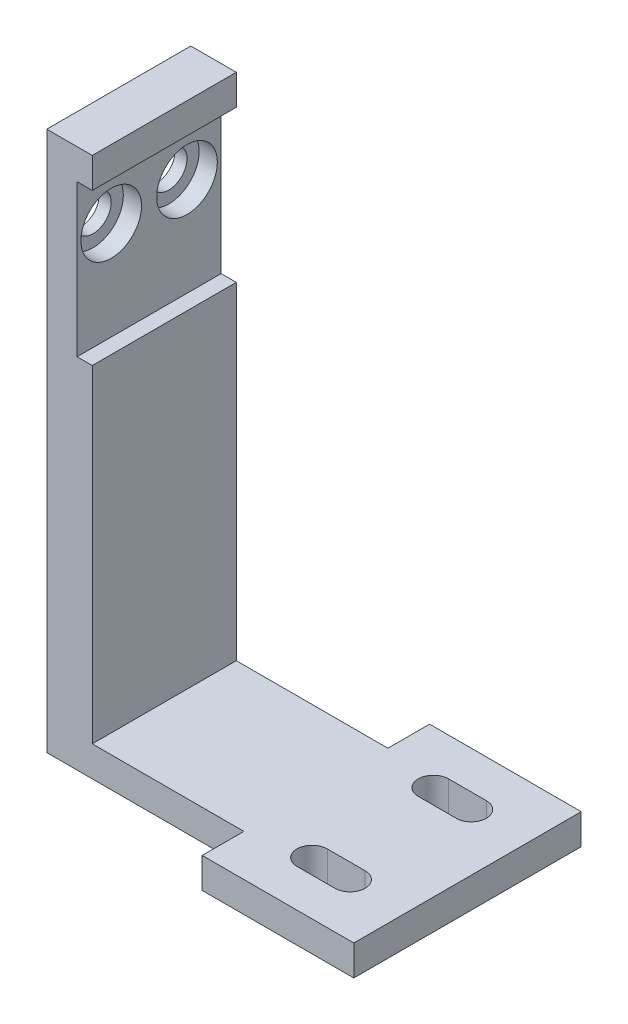
ISO-10303-21;
HEADER;
FILE_DESCRIPTION(('STEP AP214'),'2;1');
FILE_NAME('part.step','',(''),(''),'','','');
FILE_SCHEMA(('AUTOMOTIVE_DESIGN { 1 0 10303 214 1 1 1 1 }'));
ENDSEC;
DATA;
#1=APPLICATION_CONTEXT('core data for automotive mechanical design processes');
#2=APPLICATION_PROTOCOL_DEFINITION('international standard','automotive_design',2000,#1);
#3=PRODUCT_CONTEXT('',#1,'mechanical');
#4=PRODUCT('Part','Part','',(#3));
#5=PRODUCT_RELATED_PRODUCT_CATEGORY('part','',(#4));
#6=PRODUCT_DEFINITION_FORMATION('','',#4);
#7=PRODUCT_DEFINITION_CONTEXT('part definition',#1,'design');
#8=PRODUCT_DEFINITION('design','',#6,#7);
#9=PRODUCT_DEFINITION_SHAPE('','',#8);
#10=(LENGTH_UNIT() NAMED_UNIT(*) SI_UNIT(.MILLI.,.METRE.));
#11=(NAMED_UNIT(*) PLANE_ANGLE_UNIT() SI_UNIT($,.RADIAN.));
#12=(NAMED_UNIT(*) SI_UNIT($,.STERADIAN.) SOLID_ANGLE_UNIT());
#13=UNCERTAINTY_MEASURE_WITH_UNIT(LENGTH_MEASURE(1.E-05),#10,'distance_accuracy_value','');
#14=(GEOMETRIC_REPRESENTATION_CONTEXT(3) GLOBAL_UNCERTAINTY_ASSIGNED_CONTEXT((#13)) GLOBAL_UNIT_ASSIGNED_CONTEXT((#10,
#11,#12)) REPRESENTATION_CONTEXT('',''));
#15=CARTESIAN_POINT('',(0.,0.,0.));
#16=DIRECTION('',(0.,0.,1.));
#17=DIRECTION('',(1.,0.,0.));
#18=AXIS2_PLACEMENT_3D('',#15,#16,#17);
#19=CARTESIAN_POINT('',(-17.5373741798521,22.,-2.5));
#20=DIRECTION('',(1.,0.,0.));
#21=DIRECTION('',(0.,0.,-1.));
#22=AXIS2_PLACEMENT_3D('',#19,#20,#21);
#23=CYLINDRICAL_SURFACE('',#22,1.2);
#24=CARTESIAN_POINT('',(-19.5373741798521,22.,-2.5));
#25=DIRECTION('',(1.,0.,0.));
#26=DIRECTION('',(0.,0.,-1.));
#27=AXIS2_PLACEMENT_3D('',#24,#25,#26);
#28=CIRCLE('',#27,1.2);
#29=CARTESIAN_POINT('',(-19.5373741798521,22.,-3.7));
#30=VERTEX_POINT('',#29);
#31=EDGE_CURVE('E337',#30,#30,#28,.T.);
#32=ORIENTED_EDGE('',*,*,#31,.F.);
#33=EDGE_LOOP('',(#32));
#34=FACE_BOUND('',#33,.T.);
#35=CARTESIAN_POINT('',(-18.7373741798521,22.,-2.5));
#36=DIRECTION('',(1.,0.,0.));
#37=DIRECTION('',(0.,0.,-1.));
#38=AXIS2_PLACEMENT_3D('',#35,#36,#37);
#39=CIRCLE('',#38,1.2);
#40=CARTESIAN_POINT('',(-18.7373741798521,22.,-3.7));
#41=VERTEX_POINT('',#40);
#42=EDGE_CURVE('E338',#41,#41,#39,.F.);
#43=ORIENTED_EDGE('',*,*,#42,.F.);
#44=EDGE_LOOP('',(#43));
#45=FACE_BOUND('',#44,.T.);
#46=ADVANCED_FACE('F41',(#34,#45),#23,.F.);
#47=CARTESIAN_POINT('',(-17.5373741798521,22.,2.5));
#48=DIRECTION('',(1.,0.,0.));
#49=DIRECTION('',(0.,0.,-1.));
#50=AXIS2_PLACEMENT_3D('',#47,#48,#49);
#51=CYLINDRICAL_SURFACE('',#50,1.2);
#52=CARTESIAN_POINT('',(-19.5373741798521,22.,2.5));
#53=DIRECTION('',(1.,0.,0.));
#54=DIRECTION('',(0.,0.,-1.));
#55=AXIS2_PLACEMENT_3D('',#52,#53,#54);
#56=CIRCLE('',#55,1.2);
#57=CARTESIAN_POINT('',(-19.5373741798521,22.,1.3));
#58=VERTEX_POINT('',#57);
#59=EDGE_CURVE('E333',#58,#58,#56,.T.);
#60=ORIENTED_EDGE('',*,*,#59,.F.);
#61=EDGE_LOOP('',(#60));
#62=FACE_BOUND('',#61,.T.);
#63=CARTESIAN_POINT('',(-18.7373741798521,22.,2.5));
#64=DIRECTION('',(1.,0.,0.));
#65=DIRECTION('',(0.,0.,-1.));
#66=AXIS2_PLACEMENT_3D('',#63,#64,#65);
#67=CIRCLE('',#66,1.2);
#68=CARTESIAN_POINT('',(-18.7373741798521,22.,1.3));
#69=VERTEX_POINT('',#68);
#70=EDGE_CURVE('E321',#69,#69,#67,.F.);
#71=ORIENTED_EDGE('',*,*,#70,.F.);
#72=EDGE_LOOP('',(#71));
#73=FACE_BOUND('',#72,.T.);
#74=ADVANCED_FACE('F445',(#62,#73),#51,.F.);
#75=CARTESIAN_POINT('',(-16.537374179852,15.5,4.75));
#76=DIRECTION('',(-1.,0.,0.));
#77=DIRECTION('',(0.,0.,1.));
#78=AXIS2_PLACEMENT_3D('',#75,#76,#77);
#79=PLANE('',#78);
#80=DIRECTION('',(0.,1.,0.));
#81=VECTOR('',#80,1.);
#82=CARTESIAN_POINT('',(-16.537374179852,15.5,-4.75));
#83=LINE('',#82,#81);
#84=CARTESIAN_POINT('',(-16.537374179852,-6.11,-4.75));
#85=VERTEX_POINT('',#84);
#86=CARTESIAN_POINT('',(-16.537374179852,15.5,-4.75));
#87=VERTEX_POINT('',#86);
#88=EDGE_CURVE('E342',#85,#87,#83,.T.);
#89=ORIENTED_EDGE('',*,*,#88,.T.);
#90=DIRECTION('',(0.,0.,-1.));
#91=VECTOR('',#90,1.);
#92=CARTESIAN_POINT('',(-16.537374179852,15.5,4.75));
#93=LINE('',#92,#91);
#94=CARTESIAN_POINT('',(-16.537374179852,15.5,4.75));
#95=VERTEX_POINT('',#94);
#96=EDGE_CURVE('E50',#95,#87,#93,.T.);
#97=ORIENTED_EDGE('',*,*,#96,.F.);
#98=DIRECTION('',(0.,1.,0.));
#99=VECTOR('',#98,1.);
#100=CARTESIAN_POINT('',(-16.537374179852,12.5,4.75));
#101=LINE('',#100,#99);
#102=CARTESIAN_POINT('',(-16.537374179852,-6.11,4.75));
#103=VERTEX_POINT('',#102);
#104=EDGE_CURVE('E343',#103,#95,#101,.T.);
#105=ORIENTED_EDGE('',*,*,#104,.F.);
#106=DIRECTION('',(0.,0.,-1.));
#107=VECTOR('',#106,1.);
#108=CARTESIAN_POINT('',(-16.537374179852,-6.11,4.75));
#109=LINE('',#108,#107);
#110=EDGE_CURVE('E371',#103,#85,#109,.T.);
#111=ORIENTED_EDGE('',*,*,#110,.T.);
#112=EDGE_LOOP('',(#89,#97,#105,#111));
#113=FACE_BOUND('',#112,.T.);
#114=ADVANCED_FACE('F43',(#113),#79,.F.);
#115=CARTESIAN_POINT('',(-17.537374179852,15.5,4.75));
#116=DIRECTION('',(0.,-1.,0.));
#117=DIRECTION('',(0.,0.,-1.));
#118=AXIS2_PLACEMENT_3D('',#115,#116,#117);
#119=PLANE('',#118);
#120=DIRECTION('',(-1.,0.,0.));
#121=VECTOR('',#120,1.);
#122=CARTESIAN_POINT('',(-17.537374179852,15.5,-4.75));
#123=LINE('',#122,#121);
#124=CARTESIAN_POINT('',(-17.537374179852,15.5,-4.75));
#125=VERTEX_POINT('',#124);
#126=EDGE_CURVE('E374',#87,#125,#123,.T.);
#127=ORIENTED_EDGE('',*,*,#126,.T.);
#128=DIRECTION('',(0.,0.,-1.));
#129=VECTOR('',#128,1.);
#130=CARTESIAN_POINT('',(-17.537374179852,15.5,4.75));
#131=LINE('',#130,#129);
#132=CARTESIAN_POINT('',(-17.537374179852,15.5,4.75));
#133=VERTEX_POINT('',#132);
#134=EDGE_CURVE('E429',#133,#125,#131,.T.);
#135=ORIENTED_EDGE('',*,*,#134,.F.);
#136=DIRECTION('',(-1.,0.,0.));
#137=VECTOR('',#136,1.);
#138=CARTESIAN_POINT('',(-17.537374179852,15.5,4.75));
#139=LINE('',#138,#137);
#140=EDGE_CURVE('E346',#95,#133,#139,.T.);
#141=ORIENTED_EDGE('',*,*,#140,.F.);
#142=ORIENTED_EDGE('',*,*,#96,.T.);
#143=EDGE_LOOP('',(#127,#135,#141,#142));
#144=FACE_BOUND('',#143,.T.);
#145=ADVANCED_FACE('F493',(#144),#119,.F.);
#146=CARTESIAN_POINT('',(-17.537374179852,15.5,4.75));
#147=DIRECTION('',(-1.,0.,0.));
#148=DIRECTION('',(0.,-1.,0.));
#149=AXIS2_PLACEMENT_3D('',#146,#147,#148);
#150=PLANE('',#149);
#151=CARTESIAN_POINT('',(-17.5373741798521,22.,2.5));
#152=DIRECTION('',(1.,0.,0.));
#153=DIRECTION('',(0.,0.,-1.));
#154=AXIS2_PLACEMENT_3D('',#151,#152,#153);
#155=CIRCLE('',#154,2.);
#156=CARTESIAN_POINT('',(-17.5373741798521,22.,0.499999999999998));
#157=VERTEX_POINT('',#156);
#158=EDGE_CURVE('E322',#157,#157,#155,.T.);
#159=ORIENTED_EDGE('',*,*,#158,.F.);
#160=EDGE_LOOP('',(#159));
#161=FACE_BOUND('',#160,.T.);
#162=CARTESIAN_POINT('',(-17.5373741798521,22.,-2.5));
#163=DIRECTION('',(1.,0.,0.));
#164=DIRECTION('',(0.,0.,-1.));
#165=AXIS2_PLACEMENT_3D('',#162,#163,#164);
#166=CIRCLE('',#165,2.);
#167=CARTESIAN_POINT('',(-17.5373741798521,22.,-4.5));
#168=VERTEX_POINT('',#167);
#169=EDGE_CURVE('E316',#168,#168,#166,.T.);
#170=ORIENTED_EDGE('',*,*,#169,.F.);
#171=EDGE_LOOP('',(#170));
#172=FACE_BOUND('',#171,.T.);
#173=DIRECTION('',(0.,1.,0.));
#174=VECTOR('',#173,1.);
#175=CARTESIAN_POINT('',(-17.537374179852,15.5,-4.75));
#176=LINE('',#175,#174);
#177=CARTESIAN_POINT('',(-17.537374179852,25.5,-4.75));
#178=VERTEX_POINT('',#177);
#179=EDGE_CURVE('E377',#125,#178,#176,.T.);
#180=ORIENTED_EDGE('',*,*,#179,.T.);
#181=DIRECTION('',(0.,0.,-1.));
#182=VECTOR('',#181,1.);
#183=CARTESIAN_POINT('',(-17.537374179852,25.5,4.75));
#184=LINE('',#183,#182);
#185=CARTESIAN_POINT('',(-17.537374179852,25.5,4.75));
#186=VERTEX_POINT('',#185);
#187=EDGE_CURVE('E425',#186,#178,#184,.T.);
#188=ORIENTED_EDGE('',*,*,#187,.F.);
#189=DIRECTION('',(0.,1.,0.));
#190=VECTOR('',#189,1.);
#191=CARTESIAN_POINT('',(-17.537374179852,15.5,4.75));
#192=LINE('',#191,#190);
#193=EDGE_CURVE('E350',#133,#186,#192,.T.);
#194=ORIENTED_EDGE('',*,*,#193,.F.);
#195=ORIENTED_EDGE('',*,*,#134,.T.);
#196=EDGE_LOOP('',(#180,#188,#194,#195));
#197=FACE_BOUND('',#196,.T.);
#198=ADVANCED_FACE('F490',(#161,#172,#197),#150,.F.);
#199=CARTESIAN_POINT('',(-17.537374179852,25.5,4.75));
#200=DIRECTION('',(0.,1.,0.));
#201=DIRECTION('',(0.,0.,1.));
#202=AXIS2_PLACEMENT_3D('',#199,#200,#201);
#203=PLANE('',#202);
#204=DIRECTION('',(1.,0.,0.));
#205=VECTOR('',#204,1.);
#206=CARTESIAN_POINT('',(-17.537374179852,25.5,-4.75));
#207=LINE('',#206,#205);
#208=CARTESIAN_POINT('',(-16.537374179852,25.5,-4.75));
#209=VERTEX_POINT('',#208);
#210=EDGE_CURVE('E380',#178,#209,#207,.T.);
#211=ORIENTED_EDGE('',*,*,#210,.T.);
#212=DIRECTION('',(0.,0.,-1.));
#213=VECTOR('',#212,1.);
#214=CARTESIAN_POINT('',(-16.537374179852,25.5,4.75));
#215=LINE('',#214,#213);
#216=CARTESIAN_POINT('',(-16.537374179852,25.5,4.75));
#217=VERTEX_POINT('',#216);
#218=EDGE_CURVE('E421',#217,#209,#215,.T.);
#219=ORIENTED_EDGE('',*,*,#218,.F.);
#220=DIRECTION('',(1.,0.,0.));
#221=VECTOR('',#220,1.);
#222=CARTESIAN_POINT('',(-17.537374179852,25.5,4.75));
#223=LINE('',#222,#221);
#224=EDGE_CURVE('E353',#186,#217,#223,.T.);
#225=ORIENTED_EDGE('',*,*,#224,.F.);
#226=ORIENTED_EDGE('',*,*,#187,.T.);
#227=EDGE_LOOP('',(#211,#219,#225,#226));
#228=FACE_BOUND('',#227,.T.);
#229=ADVANCED_FACE('F486',(#228),#203,.F.);
#230=CARTESIAN_POINT('',(-16.537374179852,27.5,4.75));
#231=DIRECTION('',(-1.,0.,0.));
#232=DIRECTION('',(0.,-1.,0.));
#233=AXIS2_PLACEMENT_3D('',#230,#231,#232);
#234=PLANE('',#233);
#235=DIRECTION('',(0.,1.,0.));
#236=VECTOR('',#235,1.);
#237=CARTESIAN_POINT('',(-16.537374179852,27.5,-4.75));
#238=LINE('',#237,#236);
#239=CARTESIAN_POINT('',(-16.537374179852,27.5,-4.75));
#240=VERTEX_POINT('',#239);
#241=EDGE_CURVE('E383',#209,#240,#238,.T.);
#242=ORIENTED_EDGE('',*,*,#241,.T.);
#243=DIRECTION('',(0.,0.,-1.));
#244=VECTOR('',#243,1.);
#245=CARTESIAN_POINT('',(-16.537374179852,27.5,4.75));
#246=LINE('',#245,#244);
#247=CARTESIAN_POINT('',(-16.537374179852,27.5,4.75));
#248=VERTEX_POINT('',#247);
#249=EDGE_CURVE('E417',#248,#240,#246,.T.);
#250=ORIENTED_EDGE('',*,*,#249,.F.);
#251=DIRECTION('',(0.,1.,0.));
#252=VECTOR('',#251,1.);
#253=CARTESIAN_POINT('',(-16.537374179852,27.5,4.75));
#254=LINE('',#253,#252);
#255=EDGE_CURVE('E356',#217,#248,#254,.T.);
#256=ORIENTED_EDGE('',*,*,#255,.F.);
#257=ORIENTED_EDGE('',*,*,#218,.T.);
#258=EDGE_LOOP('',(#242,#250,#256,#257));
#259=FACE_BOUND('',#258,.T.);
#260=ADVANCED_FACE('F482',(#259),#234,.F.);
#261=CARTESIAN_POINT('',(-19.537374179852,27.5,4.75));
#262=DIRECTION('',(0.,-1.,0.));
#263=DIRECTION('',(0.,0.,-1.));
#264=AXIS2_PLACEMENT_3D('',#261,#262,#263);
#265=PLANE('',#264);
#266=DIRECTION('',(-1.,0.,0.));
#267=VECTOR('',#266,1.);
#268=CARTESIAN_POINT('',(-19.537374179852,27.5,-4.75));
#269=LINE('',#268,#267);
#270=CARTESIAN_POINT('',(-19.537374179852,27.5,-4.75));
#271=VERTEX_POINT('',#270);
#272=EDGE_CURVE('E386',#240,#271,#269,.T.);
#273=ORIENTED_EDGE('',*,*,#272,.T.);
#274=DIRECTION('',(0.,0.,-1.));
#275=VECTOR('',#274,1.);
#276=CARTESIAN_POINT('',(-19.537374179852,27.5,4.75));
#277=LINE('',#276,#275);
#278=CARTESIAN_POINT('',(-19.537374179852,27.5,4.75));
#279=VERTEX_POINT('',#278);
#280=EDGE_CURVE('E413',#279,#271,#277,.T.);
#281=ORIENTED_EDGE('',*,*,#280,.F.);
#282=DIRECTION('',(-1.,0.,0.));
#283=VECTOR('',#282,1.);
#284=CARTESIAN_POINT('',(-19.537374179852,27.5,4.75));
#285=LINE('',#284,#283);
#286=EDGE_CURVE('E359',#248,#279,#285,.T.);
#287=ORIENTED_EDGE('',*,*,#286,.F.);
#288=ORIENTED_EDGE('',*,*,#249,.T.);
#289=EDGE_LOOP('',(#273,#281,#287,#288));
#290=FACE_BOUND('',#289,.T.);
#291=ADVANCED_FACE('F478',(#290),#265,.F.);
#292=CARTESIAN_POINT('',(-19.537374179852,0.,4.75));
#293=DIRECTION('',(1.,0.,0.));
#294=DIRECTION('',(0.,0.,-1.));
#295=AXIS2_PLACEMENT_3D('',#292,#293,#294);
#296=PLANE('',#295);
#297=ORIENTED_EDGE('',*,*,#59,.T.);
#298=EDGE_LOOP('',(#297));
#299=FACE_BOUND('',#298,.T.);
#300=ORIENTED_EDGE('',*,*,#31,.T.);
#301=EDGE_LOOP('',(#300));
#302=FACE_BOUND('',#301,.T.);
#303=DIRECTION('',(0.,-1.,0.));
#304=VECTOR('',#303,1.);
#305=CARTESIAN_POINT('',(-19.537374179852,0.,-4.75));
#306=LINE('',#305,#304);
#307=CARTESIAN_POINT('',(-19.537374179852,-8.11,-4.75));
#308=VERTEX_POINT('',#307);
#309=EDGE_CURVE('E390',#271,#308,#306,.T.);
#310=ORIENTED_EDGE('',*,*,#309,.T.);
#311=DIRECTION('',(0.,0.,-1.));
#312=VECTOR('',#311,1.);
#313=CARTESIAN_POINT('',(-19.537374179852,-8.11,4.75));
#314=LINE('',#313,#312);
#315=CARTESIAN_POINT('',(-19.537374179852,-8.11,4.75));
#316=VERTEX_POINT('',#315);
#317=EDGE_CURVE('E409',#316,#308,#314,.T.);
#318=ORIENTED_EDGE('',*,*,#317,.F.);
#319=DIRECTION('',(0.,-1.,0.));
#320=VECTOR('',#319,1.);
#321=CARTESIAN_POINT('',(-19.537374179852,0.,4.75));
#322=LINE('',#321,#320);
#323=EDGE_CURVE('E362',#279,#316,#322,.T.);
#324=ORIENTED_EDGE('',*,*,#323,.F.);
#325=ORIENTED_EDGE('',*,*,#280,.T.);
#326=EDGE_LOOP('',(#310,#318,#324,#325));
#327=FACE_BOUND('',#326,.T.);
#328=ADVANCED_FACE('F474',(#299,#302,#327),#296,.F.);
#329=CARTESIAN_POINT('',(3.46262582014795,-8.11,4.75));
#330=DIRECTION('',(0.,1.,0.));
#331=DIRECTION('',(0.,0.,1.));
#332=AXIS2_PLACEMENT_3D('',#329,#330,#331);
#333=PLANE('',#332);
#334=DIRECTION('',(-1.,0.,0.));
#335=VECTOR('',#334,1.);
#336=CARTESIAN_POINT('',(-0.287374179852046,-8.11,5.));
#337=LINE('',#336,#335);
#338=CARTESIAN_POINT('',(-0.287374179852046,-8.11,5.));
#339=VERTEX_POINT('',#338);
#340=CARTESIAN_POINT('',(-2.78737417985205,-8.11,5.));
#341=VERTEX_POINT('',#340);
#342=EDGE_CURVE('E532',#339,#341,#337,.T.);
#343=ORIENTED_EDGE('',*,*,#342,.F.);
#344=CARTESIAN_POINT('',(-0.287374179852046,-8.11,4.));
#345=DIRECTION('',(0.,1.,0.));
#346=DIRECTION('',(0.,0.,1.));
#347=AXIS2_PLACEMENT_3D('',#344,#345,#346);
#348=CIRCLE('',#347,1.);
#349=CARTESIAN_POINT('',(-0.287374179852044,-8.11,3.));
#350=VERTEX_POINT('',#349);
#351=EDGE_CURVE('E233',#350,#339,#348,.F.);
#352=ORIENTED_EDGE('',*,*,#351,.F.);
#353=DIRECTION('',(1.,0.,0.));
#354=VECTOR('',#353,1.);
#355=CARTESIAN_POINT('',(-0.287374179852044,-8.11,3.));
#356=LINE('',#355,#354);
#357=CARTESIAN_POINT('',(-2.78737417985205,-8.11,3.));
#358=VERTEX_POINT('',#357);
#359=EDGE_CURVE('E229',#358,#350,#356,.T.);
#360=ORIENTED_EDGE('',*,*,#359,.F.);
#361=CARTESIAN_POINT('',(-2.78737417985205,-8.11,4.));
#362=DIRECTION('',(0.,1.,0.));
#363=DIRECTION('',(0.,0.,1.));
#364=AXIS2_PLACEMENT_3D('',#361,#362,#363);
#365=CIRCLE('',#364,1.);
#366=EDGE_CURVE('E196',#341,#358,#365,.F.);
#367=ORIENTED_EDGE('',*,*,#366,.F.);
#368=EDGE_LOOP('',(#343,#352,#360,#367));
#369=FACE_BOUND('',#368,.T.);
#370=DIRECTION('',(-1.,0.,0.));
#371=VECTOR('',#370,1.);
#372=CARTESIAN_POINT('',(-0.287374179852045,-8.11,-3.));
#373=LINE('',#372,#371);
#374=CARTESIAN_POINT('',(-0.287374179852045,-8.11,-3.));
#375=VERTEX_POINT('',#374);
#376=CARTESIAN_POINT('',(-2.78737417985205,-8.11,-3.));
#377=VERTEX_POINT('',#376);
#378=EDGE_CURVE('E237',#375,#377,#373,.T.);
#379=ORIENTED_EDGE('',*,*,#378,.F.);
#380=CARTESIAN_POINT('',(-0.287374179852046,-8.11,-4.));
#381=DIRECTION('',(0.,1.,0.));
#382=DIRECTION('',(0.,0.,1.));
#383=AXIS2_PLACEMENT_3D('',#380,#381,#382);
#384=CIRCLE('',#383,1.);
#385=CARTESIAN_POINT('',(-0.287374179852045,-8.11,-5.));
#386=VERTEX_POINT('',#385);
#387=EDGE_CURVE('E241',#386,#375,#384,.F.);
#388=ORIENTED_EDGE('',*,*,#387,.F.);
#389=DIRECTION('',(1.,0.,0.));
#390=VECTOR('',#389,1.);
#391=CARTESIAN_POINT('',(-0.287374179852045,-8.11,-5.));
#392=LINE('',#391,#390);
#393=CARTESIAN_POINT('',(-2.78737417985205,-8.11,-5.));
#394=VERTEX_POINT('',#393);
#395=EDGE_CURVE('E244',#394,#386,#392,.T.);
#396=ORIENTED_EDGE('',*,*,#395,.F.);
#397=CARTESIAN_POINT('',(-2.78737417985205,-8.11,-4.));
#398=DIRECTION('',(0.,1.,0.));
#399=DIRECTION('',(0.,0.,1.));
#400=AXIS2_PLACEMENT_3D('',#397,#398,#399);
#401=CIRCLE('',#400,1.);
#402=EDGE_CURVE('E234',#377,#394,#401,.F.);
#403=ORIENTED_EDGE('',*,*,#402,.F.);
#404=EDGE_LOOP('',(#379,#388,#396,#403));
#405=FACE_BOUND('',#404,.T.);
#406=DIRECTION('',(1.,0.,0.));
#407=VECTOR('',#406,1.);
#408=CARTESIAN_POINT('',(3.46262582014795,-8.11,-4.75));
#409=LINE('',#408,#407);
#410=CARTESIAN_POINT('',(-6.53737417985205,-8.11,-4.75));
#411=VERTEX_POINT('',#410);
#412=EDGE_CURVE('E394',#308,#411,#409,.T.);
#413=ORIENTED_EDGE('',*,*,#412,.T.);
#414=DIRECTION('',(0.,0.,-1.));
#415=VECTOR('',#414,1.);
#416=CARTESIAN_POINT('',(-6.53737417985205,-8.11,7.5));
#417=LINE('',#416,#415);
#418=CARTESIAN_POINT('',(-6.53737417985205,-8.11,-7.5));
#419=VERTEX_POINT('',#418);
#420=EDGE_CURVE('E290',#411,#419,#417,.T.);
#421=ORIENTED_EDGE('',*,*,#420,.T.);
#422=DIRECTION('',(1.,0.,0.));
#423=VECTOR('',#422,1.);
#424=CARTESIAN_POINT('',(-6.53737417985205,-8.11,-7.5));
#425=LINE('',#424,#423);
#426=CARTESIAN_POINT('',(3.46262582014795,-8.11,-7.5));
#427=VERTEX_POINT('',#426);
#428=EDGE_CURVE('E277',#419,#427,#425,.T.);
#429=ORIENTED_EDGE('',*,*,#428,.T.);
#430=DIRECTION('',(0.,0.,-1.));
#431=VECTOR('',#430,1.);
#432=CARTESIAN_POINT('',(3.46262582014795,-8.11,4.75));
#433=LINE('',#432,#431);
#434=CARTESIAN_POINT('',(3.46262582014795,-8.11,7.5));
#435=VERTEX_POINT('',#434);
#436=EDGE_CURVE('E406',#435,#427,#433,.T.);
#437=ORIENTED_EDGE('',*,*,#436,.F.);
#438=DIRECTION('',(-1.,0.,0.));
#439=VECTOR('',#438,1.);
#440=CARTESIAN_POINT('',(3.46262582014795,-8.11,7.5));
#441=LINE('',#440,#439);
#442=CARTESIAN_POINT('',(-6.53737417985205,-8.11,7.5));
#443=VERTEX_POINT('',#442);
#444=EDGE_CURVE('E232',#435,#443,#441,.T.);
#445=ORIENTED_EDGE('',*,*,#444,.T.);
#446=CARTESIAN_POINT('',(-6.53737417985205,-8.11,4.75));
#447=VERTEX_POINT('',#446);
#448=EDGE_CURVE('E291',#443,#447,#417,.T.);
#449=ORIENTED_EDGE('',*,*,#448,.T.);
#450=DIRECTION('',(1.,0.,0.));
#451=VECTOR('',#450,1.);
#452=CARTESIAN_POINT('',(-19.537374179852,-8.11,4.75));
#453=LINE('',#452,#451);
#454=EDGE_CURVE('E365',#316,#447,#453,.T.);
#455=ORIENTED_EDGE('',*,*,#454,.F.);
#456=ORIENTED_EDGE('',*,*,#317,.T.);
#457=EDGE_LOOP('',(#413,#421,#429,#437,#445,#449,#455,#456));
#458=FACE_BOUND('',#457,.T.);
#459=ADVANCED_FACE('F470',(#369,#405,#458),#333,.F.);
#460=CARTESIAN_POINT('',(3.46262582014795,-6.11,4.75));
#461=DIRECTION('',(-1.,0.,0.));
#462=DIRECTION('',(0.,0.,1.));
#463=AXIS2_PLACEMENT_3D('',#460,#461,#462);
#464=PLANE('',#463);
#465=ORIENTED_EDGE('',*,*,#436,.T.);
#466=DIRECTION('',(0.,-1.,0.));
#467=VECTOR('',#466,1.);
#468=CARTESIAN_POINT('',(3.46262582014795,-6.11,-7.5));
#469=LINE('',#468,#467);
#470=CARTESIAN_POINT('',(3.46262582014795,-6.11,-7.5));
#471=VERTEX_POINT('',#470);
#472=EDGE_CURVE('E303',#471,#427,#469,.T.);
#473=ORIENTED_EDGE('',*,*,#472,.F.);
#474=DIRECTION('',(0.,0.,-1.));
#475=VECTOR('',#474,1.);
#476=CARTESIAN_POINT('',(3.46262582014795,-6.11,4.75));
#477=LINE('',#476,#475);
#478=CARTESIAN_POINT('',(3.46262582014795,-6.11,7.5));
#479=VERTEX_POINT('',#478);
#480=EDGE_CURVE('E403',#479,#471,#477,.T.);
#481=ORIENTED_EDGE('',*,*,#480,.F.);
#482=DIRECTION('',(0.,-1.,0.));
#483=VECTOR('',#482,1.);
#484=CARTESIAN_POINT('',(3.46262582014795,-6.11,7.5));
#485=LINE('',#484,#483);
#486=EDGE_CURVE('E298',#479,#435,#485,.T.);
#487=ORIENTED_EDGE('',*,*,#486,.T.);
#488=EDGE_LOOP('',(#465,#473,#481,#487));
#489=FACE_BOUND('',#488,.T.);
#490=ADVANCED_FACE('F467',(#489),#464,.F.);
#491=CARTESIAN_POINT('',(-16.537374179852,-6.11,4.75));
#492=DIRECTION('',(0.,-1.,0.));
#493=DIRECTION('',(0.,0.,-1.));
#494=AXIS2_PLACEMENT_3D('',#491,#492,#493);
#495=PLANE('',#494);
#496=DIRECTION('',(-1.,0.,0.));
#497=VECTOR('',#496,1.);
#498=CARTESIAN_POINT('',(-0.287374179852044,-6.11,3.));
#499=LINE('',#498,#497);
#500=CARTESIAN_POINT('',(-0.287374179852046,-6.11,3.));
#501=VERTEX_POINT('',#500);
#502=CARTESIAN_POINT('',(-2.78737417985205,-6.11,3.));
#503=VERTEX_POINT('',#502);
#504=EDGE_CURVE('E204',#501,#503,#499,.T.);
#505=ORIENTED_EDGE('',*,*,#504,.F.);
#506=CARTESIAN_POINT('',(-0.287374179852046,-6.11,4.));
#507=DIRECTION('',(0.,1.,0.));
#508=DIRECTION('',(0.,0.,1.));
#509=AXIS2_PLACEMENT_3D('',#506,#507,#508);
#510=CIRCLE('',#509,1.);
#511=CARTESIAN_POINT('',(-0.287374179852046,-6.11,5.));
#512=VERTEX_POINT('',#511);
#513=EDGE_CURVE('E210',#512,#501,#510,.T.);
#514=ORIENTED_EDGE('',*,*,#513,.F.);
#515=DIRECTION('',(1.,0.,0.));
#516=VECTOR('',#515,1.);
#517=CARTESIAN_POINT('',(-0.287374179852046,-6.11,5.));
#518=LINE('',#517,#516);
#519=CARTESIAN_POINT('',(-2.78737417985205,-6.11,5.));
#520=VERTEX_POINT('',#519);
#521=EDGE_CURVE('E215',#520,#512,#518,.T.);
#522=ORIENTED_EDGE('',*,*,#521,.F.);
#523=CARTESIAN_POINT('',(-2.78737417985205,-6.11,4.));
#524=DIRECTION('',(0.,1.,0.));
#525=DIRECTION('',(0.,0.,1.));
#526=AXIS2_PLACEMENT_3D('',#523,#524,#525);
#527=CIRCLE('',#526,1.);
#528=EDGE_CURVE('E193',#503,#520,#527,.T.);
#529=ORIENTED_EDGE('',*,*,#528,.F.);
#530=EDGE_LOOP('',(#505,#514,#522,#529));
#531=FACE_BOUND('',#530,.T.);
#532=DIRECTION('',(-1.,0.,0.));
#533=VECTOR('',#532,1.);
#534=CARTESIAN_POINT('',(-0.287374179852045,-6.11,-5.));
#535=LINE('',#534,#533);
#536=CARTESIAN_POINT('',(-0.287374179852046,-6.11,-5.));
#537=VERTEX_POINT('',#536);
#538=CARTESIAN_POINT('',(-2.78737417985205,-6.11,-5.));
#539=VERTEX_POINT('',#538);
#540=EDGE_CURVE('E248',#537,#539,#535,.T.);
#541=ORIENTED_EDGE('',*,*,#540,.F.);
#542=CARTESIAN_POINT('',(-0.287374179852046,-6.11,-4.));
#543=DIRECTION('',(0.,1.,0.));
#544=DIRECTION('',(0.,0.,-1.));
#545=AXIS2_PLACEMENT_3D('',#542,#543,#544);
#546=CIRCLE('',#545,1.);
#547=CARTESIAN_POINT('',(-0.287374179852045,-6.11,-3.));
#548=VERTEX_POINT('',#547);
#549=EDGE_CURVE('E245',#548,#537,#546,.T.);
#550=ORIENTED_EDGE('',*,*,#549,.F.);
#551=DIRECTION('',(1.,0.,0.));
#552=VECTOR('',#551,1.);
#553=CARTESIAN_POINT('',(-0.287374179852045,-6.11,-3.));
#554=LINE('',#553,#552);
#555=CARTESIAN_POINT('',(-2.78737417985205,-6.11,-3.));
#556=VERTEX_POINT('',#555);
#557=EDGE_CURVE('E255',#556,#548,#554,.T.);
#558=ORIENTED_EDGE('',*,*,#557,.F.);
#559=CARTESIAN_POINT('',(-2.78737417985205,-6.11,-4.));
#560=DIRECTION('',(0.,1.,0.));
#561=DIRECTION('',(0.,0.,-1.));
#562=AXIS2_PLACEMENT_3D('',#559,#560,#561);
#563=CIRCLE('',#562,1.);
#564=EDGE_CURVE('E251',#539,#556,#563,.T.);
#565=ORIENTED_EDGE('',*,*,#564,.F.);
#566=EDGE_LOOP('',(#541,#550,#558,#565));
#567=FACE_BOUND('',#566,.T.);
#568=DIRECTION('',(-1.,0.,0.));
#569=VECTOR('',#568,1.);
#570=CARTESIAN_POINT('',(-12.4273741798521,-6.11,4.75));
#571=LINE('',#570,#569);
#572=CARTESIAN_POINT('',(-6.53737417985205,-6.11,4.75));
#573=VERTEX_POINT('',#572);
#574=EDGE_CURVE('E368',#573,#103,#571,.T.);
#575=ORIENTED_EDGE('',*,*,#574,.F.);
#576=DIRECTION('',(0.,0.,-1.));
#577=VECTOR('',#576,1.);
#578=CARTESIAN_POINT('',(-6.53737417985205,-6.11,7.5));
#579=LINE('',#578,#577);
#580=CARTESIAN_POINT('',(-6.53737417985205,-6.11,7.5));
#581=VERTEX_POINT('',#580);
#582=EDGE_CURVE('E278',#581,#573,#579,.T.);
#583=ORIENTED_EDGE('',*,*,#582,.F.);
#584=DIRECTION('',(-1.,0.,0.));
#585=VECTOR('',#584,1.);
#586=CARTESIAN_POINT('',(3.46262582014795,-6.11,7.5));
#587=LINE('',#586,#585);
#588=EDGE_CURVE('E272',#479,#581,#587,.T.);
#589=ORIENTED_EDGE('',*,*,#588,.F.);
#590=ORIENTED_EDGE('',*,*,#480,.T.);
#591=DIRECTION('',(1.,0.,0.));
#592=VECTOR('',#591,1.);
#593=CARTESIAN_POINT('',(-6.53737417985205,-6.11,-7.5));
#594=LINE('',#593,#592);
#595=CARTESIAN_POINT('',(-6.53737417985205,-6.11,-7.5));
#596=VERTEX_POINT('',#595);
#597=EDGE_CURVE('E282',#596,#471,#594,.T.);
#598=ORIENTED_EDGE('',*,*,#597,.F.);
#599=CARTESIAN_POINT('',(-6.53737417985205,-6.11,-4.75));
#600=VERTEX_POINT('',#599);
#601=EDGE_CURVE('E276',#600,#596,#579,.T.);
#602=ORIENTED_EDGE('',*,*,#601,.F.);
#603=DIRECTION('',(-1.,0.,0.));
#604=VECTOR('',#603,1.);
#605=CARTESIAN_POINT('',(-16.537374179852,-6.11,-4.75));
#606=LINE('',#605,#604);
#607=EDGE_CURVE('E347',#600,#85,#606,.T.);
#608=ORIENTED_EDGE('',*,*,#607,.T.);
#609=ORIENTED_EDGE('',*,*,#110,.F.);
#610=EDGE_LOOP('',(#575,#583,#589,#590,#598,#602,#608,#609));
#611=FACE_BOUND('',#610,.T.);
#612=ADVANCED_FACE('F212',(#531,#567,#611),#495,.F.);
#613=CARTESIAN_POINT('',(0.,0.,4.75));
#614=DIRECTION('',(0.,0.,1.));
#615=DIRECTION('',(1.,0.,0.));
#616=AXIS2_PLACEMENT_3D('',#613,#614,#615);
#617=PLANE('',#616);
#618=DIRECTION('',(0.,-1.,0.));
#619=VECTOR('',#618,1.);
#620=CARTESIAN_POINT('',(-6.53737417985205,0.,4.75));
#621=LINE('',#620,#619);
#622=EDGE_CURVE('E302',#573,#447,#621,.T.);
#623=ORIENTED_EDGE('',*,*,#622,.F.);
#624=ORIENTED_EDGE('',*,*,#574,.T.);
#625=ORIENTED_EDGE('',*,*,#104,.T.);
#626=ORIENTED_EDGE('',*,*,#140,.T.);
#627=ORIENTED_EDGE('',*,*,#193,.T.);
#628=ORIENTED_EDGE('',*,*,#224,.T.);
#629=ORIENTED_EDGE('',*,*,#255,.T.);
#630=ORIENTED_EDGE('',*,*,#286,.T.);
#631=ORIENTED_EDGE('',*,*,#323,.T.);
#632=ORIENTED_EDGE('',*,*,#454,.T.);
#633=EDGE_LOOP('',(#623,#624,#625,#626,#627,#628,#629,#630,#631,#632));
#634=FACE_BOUND('',#633,.T.);
#635=ADVANCED_FACE('F456',(#634),#617,.T.);
#636=CARTESIAN_POINT('',(0.,0.,-4.75));
#637=DIRECTION('',(0.,0.,1.));
#638=DIRECTION('',(1.,0.,0.));
#639=AXIS2_PLACEMENT_3D('',#636,#637,#638);
#640=PLANE('',#639);
#641=ORIENTED_EDGE('',*,*,#607,.F.);
#642=DIRECTION('',(0.,-1.,0.));
#643=VECTOR('',#642,1.);
#644=CARTESIAN_POINT('',(-6.53737417985205,0.,-4.75));
#645=LINE('',#644,#643);
#646=EDGE_CURVE('E11',#600,#411,#645,.T.);
#647=ORIENTED_EDGE('',*,*,#646,.T.);
#648=ORIENTED_EDGE('',*,*,#412,.F.);
#649=ORIENTED_EDGE('',*,*,#309,.F.);
#650=ORIENTED_EDGE('',*,*,#272,.F.);
#651=ORIENTED_EDGE('',*,*,#241,.F.);
#652=ORIENTED_EDGE('',*,*,#210,.F.);
#653=ORIENTED_EDGE('',*,*,#179,.F.);
#654=ORIENTED_EDGE('',*,*,#126,.F.);
#655=ORIENTED_EDGE('',*,*,#88,.F.);
#656=EDGE_LOOP('',(#641,#647,#648,#649,#650,#651,#652,#653,#654,#655));
#657=FACE_BOUND('',#656,.T.);
#658=ADVANCED_FACE('F459',(#657),#640,.F.);
#659=CARTESIAN_POINT('',(-18.7373741798521,22.,2.5));
#660=DIRECTION('',(1.,0.,0.));
#661=DIRECTION('',(0.,0.,-1.));
#662=AXIS2_PLACEMENT_3D('',#659,#660,#661);
#663=PLANE('',#662);
#664=CARTESIAN_POINT('',(-18.7373741798521,22.,2.5));
#665=DIRECTION('',(1.,0.,0.));
#666=DIRECTION('',(0.,0.,-1.));
#667=AXIS2_PLACEMENT_3D('',#664,#665,#666);
#668=CIRCLE('',#667,2.);
#669=CARTESIAN_POINT('',(-18.7373741798521,22.,0.499999999999998));
#670=VERTEX_POINT('',#669);
#671=EDGE_CURVE('E317',#670,#670,#668,.T.);
#672=ORIENTED_EDGE('',*,*,#671,.T.);
#673=EDGE_LOOP('',(#672));
#674=FACE_BOUND('',#673,.T.);
#675=ORIENTED_EDGE('',*,*,#70,.T.);
#676=EDGE_LOOP('',(#675));
#677=FACE_BOUND('',#676,.T.);
#678=ADVANCED_FACE('F463',(#674,#677),#663,.T.);
#679=CARTESIAN_POINT('',(-18.7373741798521,22.,2.5));
#680=DIRECTION('',(1.,0.,0.));
#681=DIRECTION('',(0.,0.,-1.));
#682=AXIS2_PLACEMENT_3D('',#679,#680,#681);
#683=CYLINDRICAL_SURFACE('',#682,2.);
#684=ORIENTED_EDGE('',*,*,#671,.F.);
#685=EDGE_LOOP('',(#684));
#686=FACE_BOUND('',#685,.T.);
#687=ORIENTED_EDGE('',*,*,#158,.T.);
#688=EDGE_LOOP('',(#687));
#689=FACE_BOUND('',#688,.T.);
#690=ADVANCED_FACE('F708',(#686,#689),#683,.F.);
#691=CARTESIAN_POINT('',(-18.7373741798521,22.,-2.5));
#692=DIRECTION('',(1.,0.,0.));
#693=DIRECTION('',(0.,0.,-1.));
#694=AXIS2_PLACEMENT_3D('',#691,#692,#693);
#695=PLANE('',#694);
#696=CARTESIAN_POINT('',(-18.7373741798521,22.,-2.5));
#697=DIRECTION('',(1.,0.,0.));
#698=DIRECTION('',(0.,0.,-1.));
#699=AXIS2_PLACEMENT_3D('',#696,#697,#698);
#700=CIRCLE('',#699,2.);
#701=CARTESIAN_POINT('',(-18.7373741798521,22.,-4.5));
#702=VERTEX_POINT('',#701);
#703=EDGE_CURVE('E326',#702,#702,#700,.T.);
#704=ORIENTED_EDGE('',*,*,#703,.T.);
#705=EDGE_LOOP('',(#704));
#706=FACE_BOUND('',#705,.T.);
#707=ORIENTED_EDGE('',*,*,#42,.T.);
#708=EDGE_LOOP('',(#707));
#709=FACE_BOUND('',#708,.T.);
#710=ADVANCED_FACE('F442',(#706,#709),#695,.T.);
#711=CARTESIAN_POINT('',(-18.7373741798521,22.,-2.5));
#712=DIRECTION('',(1.,0.,0.));
#713=DIRECTION('',(0.,0.,-1.));
#714=AXIS2_PLACEMENT_3D('',#711,#712,#713);
#715=CYLINDRICAL_SURFACE('',#714,2.);
#716=ORIENTED_EDGE('',*,*,#703,.F.);
#717=EDGE_LOOP('',(#716));
#718=FACE_BOUND('',#717,.T.);
#719=ORIENTED_EDGE('',*,*,#169,.T.);
#720=EDGE_LOOP('',(#719));
#721=FACE_BOUND('',#720,.T.);
#722=ADVANCED_FACE('F575',(#718,#721),#715,.F.);
#723=CARTESIAN_POINT('',(-6.53737417985205,-6.11,-7.5));
#724=DIRECTION('',(0.,0.,-1.));
#725=DIRECTION('',(-1.,0.,0.));
#726=AXIS2_PLACEMENT_3D('',#723,#724,#725);
#727=PLANE('',#726);
#728=ORIENTED_EDGE('',*,*,#428,.F.);
#729=DIRECTION('',(0.,-1.,0.));
#730=VECTOR('',#729,1.);
#731=CARTESIAN_POINT('',(-6.53737417985205,-6.11,-7.5));
#732=LINE('',#731,#730);
#733=EDGE_CURVE('E307',#596,#419,#732,.T.);
#734=ORIENTED_EDGE('',*,*,#733,.F.);
#735=ORIENTED_EDGE('',*,*,#597,.T.);
#736=ORIENTED_EDGE('',*,*,#472,.T.);
#737=EDGE_LOOP('',(#728,#734,#735,#736));
#738=FACE_BOUND('',#737,.T.);
#739=ADVANCED_FACE('F566',(#738),#727,.T.);
#740=CARTESIAN_POINT('',(-6.53737417985205,-6.11,7.5));
#741=DIRECTION('',(-1.,0.,0.));
#742=DIRECTION('',(0.,-1.,0.));
#743=AXIS2_PLACEMENT_3D('',#740,#741,#742);
#744=PLANE('',#743);
#745=ORIENTED_EDGE('',*,*,#646,.F.);
#746=ORIENTED_EDGE('',*,*,#601,.T.);
#747=ORIENTED_EDGE('',*,*,#733,.T.);
#748=ORIENTED_EDGE('',*,*,#420,.F.);
#749=EDGE_LOOP('',(#745,#746,#747,#748));
#750=FACE_BOUND('',#749,.T.);
#751=ADVANCED_FACE('F567',(#750),#744,.T.);
#752=CARTESIAN_POINT('',(3.46262582014795,-6.11,7.5));
#753=DIRECTION('',(0.,0.,1.));
#754=DIRECTION('',(1.,0.,0.));
#755=AXIS2_PLACEMENT_3D('',#752,#753,#754);
#756=PLANE('',#755);
#757=ORIENTED_EDGE('',*,*,#444,.F.);
#758=ORIENTED_EDGE('',*,*,#486,.F.);
#759=ORIENTED_EDGE('',*,*,#588,.T.);
#760=DIRECTION('',(0.,-1.,0.));
#761=VECTOR('',#760,1.);
#762=CARTESIAN_POINT('',(-6.53737417985205,-6.11,7.5));
#763=LINE('',#762,#761);
#764=EDGE_CURVE('E286',#581,#443,#763,.T.);
#765=ORIENTED_EDGE('',*,*,#764,.T.);
#766=EDGE_LOOP('',(#757,#758,#759,#765));
#767=FACE_BOUND('',#766,.T.);
#768=ADVANCED_FACE('F561',(#767),#756,.T.);
#769=ORIENTED_EDGE('',*,*,#582,.T.);
#770=ORIENTED_EDGE('',*,*,#622,.T.);
#771=ORIENTED_EDGE('',*,*,#448,.F.);
#772=ORIENTED_EDGE('',*,*,#764,.F.);
#773=EDGE_LOOP('',(#769,#770,#771,#772));
#774=FACE_BOUND('',#773,.T.);
#775=ADVANCED_FACE('F556',(#774),#744,.T.);
#776=CARTESIAN_POINT('',(-0.287374179852046,-13.0344289008981,-4.));
#777=DIRECTION('',(0.,1.,0.));
#778=DIRECTION('',(0.,0.,1.));
#779=AXIS2_PLACEMENT_3D('',#776,#777,#778);
#780=CYLINDRICAL_SURFACE('',#779,1.);
#781=ORIENTED_EDGE('',*,*,#387,.T.);
#782=DIRECTION('',(0.,1.,0.));
#783=VECTOR('',#782,1.);
#784=CARTESIAN_POINT('',(-0.287374179852045,-13.0344289008981,-3.));
#785=LINE('',#784,#783);
#786=EDGE_CURVE('E238',#375,#548,#785,.T.);
#787=ORIENTED_EDGE('',*,*,#786,.T.);
#788=ORIENTED_EDGE('',*,*,#549,.T.);
#789=DIRECTION('',(0.,1.,0.));
#790=VECTOR('',#789,1.);
#791=CARTESIAN_POINT('',(-0.287374179852045,-13.0344289008981,-5.));
#792=LINE('',#791,#790);
#793=EDGE_CURVE('E259',#386,#537,#792,.T.);
#794=ORIENTED_EDGE('',*,*,#793,.F.);
#795=EDGE_LOOP('',(#781,#787,#788,#794));
#796=FACE_BOUND('',#795,.T.);
#797=ADVANCED_FACE('F578',(#796),#780,.F.);
#798=CARTESIAN_POINT('',(-0.287374179852045,-13.0344289008981,-3.));
#799=DIRECTION('',(0.,0.,1.));
#800=DIRECTION('',(1.,0.,0.));
#801=AXIS2_PLACEMENT_3D('',#798,#799,#800);
#802=PLANE('',#801);
#803=ORIENTED_EDGE('',*,*,#378,.T.);
#804=DIRECTION('',(0.,1.,0.));
#805=VECTOR('',#804,1.);
#806=CARTESIAN_POINT('',(-2.78737417985205,-13.0344289008981,-3.));
#807=LINE('',#806,#805);
#808=EDGE_CURVE('E262',#377,#556,#807,.T.);
#809=ORIENTED_EDGE('',*,*,#808,.T.);
#810=ORIENTED_EDGE('',*,*,#557,.T.);
#811=ORIENTED_EDGE('',*,*,#786,.F.);
#812=EDGE_LOOP('',(#803,#809,#810,#811));
#813=FACE_BOUND('',#812,.T.);
#814=ADVANCED_FACE('F582',(#813),#802,.F.);
#815=CARTESIAN_POINT('',(-2.78737417985205,-13.0344289008981,-4.));
#816=DIRECTION('',(0.,1.,0.));
#817=DIRECTION('',(0.,0.,1.));
#818=AXIS2_PLACEMENT_3D('',#815,#816,#817);
#819=CYLINDRICAL_SURFACE('',#818,1.);
#820=ORIENTED_EDGE('',*,*,#402,.T.);
#821=DIRECTION('',(0.,1.,0.));
#822=VECTOR('',#821,1.);
#823=CARTESIAN_POINT('',(-2.78737417985205,-13.0344289008981,-5.));
#824=LINE('',#823,#822);
#825=EDGE_CURVE('E65',#394,#539,#824,.T.);
#826=ORIENTED_EDGE('',*,*,#825,.T.);
#827=ORIENTED_EDGE('',*,*,#564,.T.);
#828=ORIENTED_EDGE('',*,*,#808,.F.);
#829=EDGE_LOOP('',(#820,#826,#827,#828));
#830=FACE_BOUND('',#829,.T.);
#831=ADVANCED_FACE('F588',(#830),#819,.F.);
#832=CARTESIAN_POINT('',(-0.287374179852045,-13.0344289008981,-5.));
#833=DIRECTION('',(0.,0.,-1.));
#834=DIRECTION('',(-1.,0.,0.));
#835=AXIS2_PLACEMENT_3D('',#832,#833,#834);
#836=PLANE('',#835);
#837=ORIENTED_EDGE('',*,*,#395,.T.);
#838=ORIENTED_EDGE('',*,*,#793,.T.);
#839=ORIENTED_EDGE('',*,*,#540,.T.);
#840=ORIENTED_EDGE('',*,*,#825,.F.);
#841=EDGE_LOOP('',(#837,#838,#839,#840));
#842=FACE_BOUND('',#841,.T.);
#843=ADVANCED_FACE('F592',(#842),#836,.F.);
#844=CARTESIAN_POINT('',(-0.287374179852046,-13.0344289008981,4.));
#845=DIRECTION('',(0.,1.,0.));
#846=DIRECTION('',(0.,0.,1.));
#847=AXIS2_PLACEMENT_3D('',#844,#845,#846);
#848=CYLINDRICAL_SURFACE('',#847,1.);
#849=ORIENTED_EDGE('',*,*,#351,.T.);
#850=DIRECTION('',(0.,1.,0.));
#851=VECTOR('',#850,1.);
#852=CARTESIAN_POINT('',(-0.287374179852046,-13.0344289008981,5.));
#853=LINE('',#852,#851);
#854=EDGE_CURVE('E222',#339,#512,#853,.T.);
#855=ORIENTED_EDGE('',*,*,#854,.T.);
#856=ORIENTED_EDGE('',*,*,#513,.T.);
#857=DIRECTION('',(0.,1.,0.));
#858=VECTOR('',#857,1.);
#859=CARTESIAN_POINT('',(-0.287374179852044,-13.0344289008981,3.));
#860=LINE('',#859,#858);
#861=EDGE_CURVE('E200',#350,#501,#860,.T.);
#862=ORIENTED_EDGE('',*,*,#861,.F.);
#863=EDGE_LOOP('',(#849,#855,#856,#862));
#864=FACE_BOUND('',#863,.T.);
#865=ADVANCED_FACE('F539',(#864),#848,.F.);
#866=CARTESIAN_POINT('',(-0.287374179852046,-13.0344289008981,5.));
#867=DIRECTION('',(0.,0.,1.));
#868=DIRECTION('',(1.,0.,0.));
#869=AXIS2_PLACEMENT_3D('',#866,#867,#868);
#870=PLANE('',#869);
#871=ORIENTED_EDGE('',*,*,#342,.T.);
#872=DIRECTION('',(0.,1.,0.));
#873=VECTOR('',#872,1.);
#874=CARTESIAN_POINT('',(-2.78737417985205,-13.0344289008981,5.));
#875=LINE('',#874,#873);
#876=EDGE_CURVE('E199',#341,#520,#875,.T.);
#877=ORIENTED_EDGE('',*,*,#876,.T.);
#878=ORIENTED_EDGE('',*,*,#521,.T.);
#879=ORIENTED_EDGE('',*,*,#854,.F.);
#880=EDGE_LOOP('',(#871,#877,#878,#879));
#881=FACE_BOUND('',#880,.T.);
#882=ADVANCED_FACE('F544',(#881),#870,.F.);
#883=CARTESIAN_POINT('',(-2.78737417985205,-13.0344289008981,4.));
#884=DIRECTION('',(0.,1.,0.));
#885=DIRECTION('',(0.,0.,1.));
#886=AXIS2_PLACEMENT_3D('',#883,#884,#885);
#887=CYLINDRICAL_SURFACE('',#886,1.);
#888=ORIENTED_EDGE('',*,*,#366,.T.);
#889=DIRECTION('',(0.,1.,0.));
#890=VECTOR('',#889,1.);
#891=CARTESIAN_POINT('',(-2.78737417985205,-13.0344289008981,3.));
#892=LINE('',#891,#890);
#893=EDGE_CURVE('E57',#358,#503,#892,.T.);
#894=ORIENTED_EDGE('',*,*,#893,.T.);
#895=ORIENTED_EDGE('',*,*,#528,.T.);
#896=ORIENTED_EDGE('',*,*,#876,.F.);
#897=EDGE_LOOP('',(#888,#894,#895,#896));
#898=FACE_BOUND('',#897,.T.);
#899=ADVANCED_FACE('F190',(#898),#887,.F.);
#900=CARTESIAN_POINT('',(-0.287374179852044,-13.0344289008981,3.));
#901=DIRECTION('',(0.,0.,-1.));
#902=DIRECTION('',(-1.,0.,0.));
#903=AXIS2_PLACEMENT_3D('',#900,#901,#902);
#904=PLANE('',#903);
#905=ORIENTED_EDGE('',*,*,#359,.T.);
#906=ORIENTED_EDGE('',*,*,#861,.T.);
#907=ORIENTED_EDGE('',*,*,#504,.T.);
#908=ORIENTED_EDGE('',*,*,#893,.F.);
#909=EDGE_LOOP('',(#905,#906,#907,#908));
#910=FACE_BOUND('',#909,.T.);
#911=ADVANCED_FACE('F205',(#910),#904,.F.);
#912=CLOSED_SHELL('',(#46,#74,#114,#145,#198,#229,#260,#291,#328,#459,#490,#612,#635,#658,#678,
#690,#710,#722,#739,#751,#768,#775,#797,#814,#831,#843,#865,#882,#899,#911));
#913=MANIFOLD_SOLID_BREP('B2',#912);
#914=ADVANCED_BREP_SHAPE_REPRESENTATION('',(#18,#913),#14);
#915=SHAPE_DEFINITION_REPRESENTATION(#9,#914);
ENDSEC;
END-ISO-10303-21;
